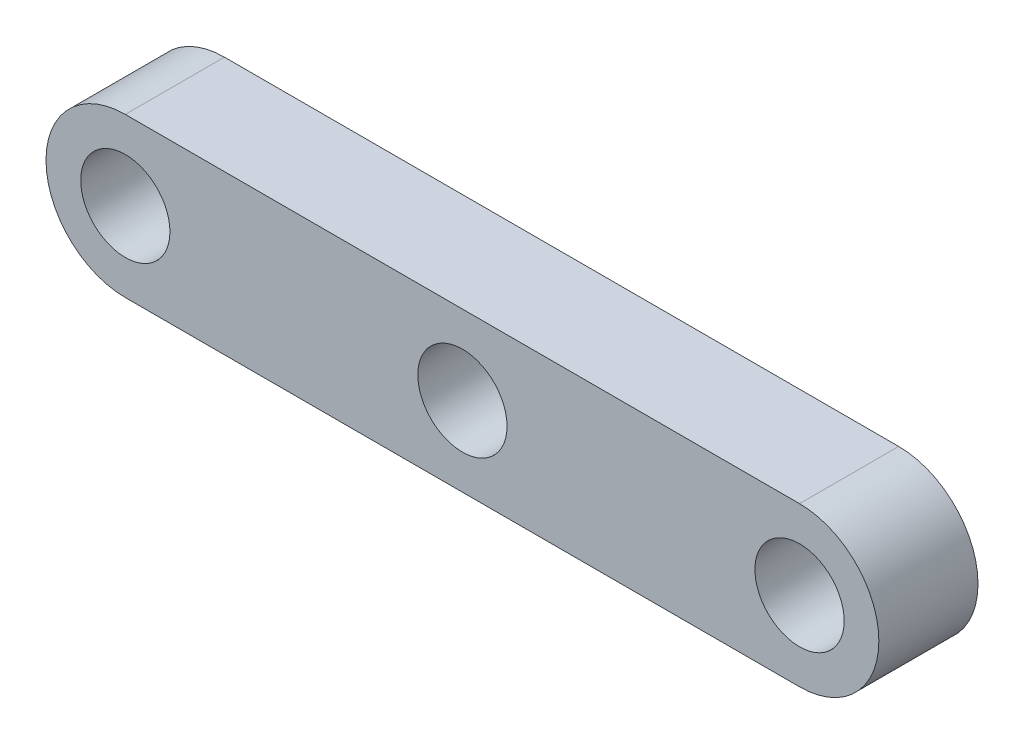
ISO-10303-21;
HEADER;
FILE_DESCRIPTION(('STEP AP214'),'2;1');
FILE_NAME('part.step','',(''),(''),'','','');
FILE_SCHEMA(('AUTOMOTIVE_DESIGN { 1 0 10303 214 1 1 1 1 }'));
ENDSEC;
DATA;
#1=APPLICATION_CONTEXT('core data for automotive mechanical design processes');
#2=APPLICATION_PROTOCOL_DEFINITION('international standard','automotive_design',2000,#1);
#3=PRODUCT_CONTEXT('',#1,'mechanical');
#4=PRODUCT('Part','Part','',(#3));
#5=PRODUCT_RELATED_PRODUCT_CATEGORY('part','',(#4));
#6=PRODUCT_DEFINITION_FORMATION('','',#4);
#7=PRODUCT_DEFINITION_CONTEXT('part definition',#1,'design');
#8=PRODUCT_DEFINITION('design','',#6,#7);
#9=PRODUCT_DEFINITION_SHAPE('','',#8);
#10=(LENGTH_UNIT() NAMED_UNIT(*) SI_UNIT(.MILLI.,.METRE.));
#11=(NAMED_UNIT(*) PLANE_ANGLE_UNIT() SI_UNIT($,.RADIAN.));
#12=(NAMED_UNIT(*) SI_UNIT($,.STERADIAN.) SOLID_ANGLE_UNIT());
#13=UNCERTAINTY_MEASURE_WITH_UNIT(LENGTH_MEASURE(1.E-05),#10,'distance_accuracy_value','');
#14=(GEOMETRIC_REPRESENTATION_CONTEXT(3) GLOBAL_UNCERTAINTY_ASSIGNED_CONTEXT((#13)) GLOBAL_UNIT_ASSIGNED_CONTEXT((#10,
#11,#12)) REPRESENTATION_CONTEXT('',''));
#15=CARTESIAN_POINT('',(0.,0.,0.));
#16=DIRECTION('',(0.,0.,1.));
#17=DIRECTION('',(1.,0.,0.));
#18=AXIS2_PLACEMENT_3D('',#15,#16,#17);
#19=CARTESIAN_POINT('',(-17.,0.,5.));
#20=DIRECTION('',(0.,0.,1.));
#21=DIRECTION('',(1.,0.,0.));
#22=AXIS2_PLACEMENT_3D('',#19,#20,#21);
#23=PLANE('',#22);
#24=CARTESIAN_POINT('',(-17.,0.,5.));
#25=DIRECTION('',(0.,0.,1.));
#26=DIRECTION('',(1.,0.,0.));
#27=AXIS2_PLACEMENT_3D('',#24,#25,#26);
#28=CIRCLE('',#27,2.25);
#29=CARTESIAN_POINT('',(-14.75,0.,5.));
#30=VERTEX_POINT('',#29);
#31=EDGE_CURVE('E115',#30,#30,#28,.T.);
#32=ORIENTED_EDGE('',*,*,#31,.F.);
#33=EDGE_LOOP('',(#32));
#34=FACE_BOUND('',#33,.T.);
#35=CARTESIAN_POINT('',(-17.,0.,5.));
#36=DIRECTION('',(0.,0.,1.));
#37=DIRECTION('',(1.,0.,0.));
#38=AXIS2_PLACEMENT_3D('',#35,#36,#37);
#39=CIRCLE('',#38,4.);
#40=CARTESIAN_POINT('',(-17.,4.,5.));
#41=VERTEX_POINT('',#40);
#42=CARTESIAN_POINT('',(-17.,-4.,5.));
#43=VERTEX_POINT('',#42);
#44=EDGE_CURVE('E85',#41,#43,#39,.T.);
#45=ORIENTED_EDGE('',*,*,#44,.T.);
#46=DIRECTION('',(1.,0.,0.));
#47=VECTOR('',#46,1.);
#48=CARTESIAN_POINT('',(-17.,-4.,5.));
#49=LINE('',#48,#47);
#50=CARTESIAN_POINT('',(17.,-4.,5.));
#51=VERTEX_POINT('',#50);
#52=EDGE_CURVE('E80',#43,#51,#49,.T.);
#53=ORIENTED_EDGE('',*,*,#52,.T.);
#54=CARTESIAN_POINT('',(17.,0.,5.));
#55=DIRECTION('',(0.,0.,1.));
#56=DIRECTION('',(1.,0.,0.));
#57=AXIS2_PLACEMENT_3D('',#54,#55,#56);
#58=CIRCLE('',#57,4.);
#59=CARTESIAN_POINT('',(17.,4.00000000000001,5.));
#60=VERTEX_POINT('',#59);
#61=EDGE_CURVE('E83',#51,#60,#58,.T.);
#62=ORIENTED_EDGE('',*,*,#61,.T.);
#63=DIRECTION('',(-1.,0.,0.));
#64=VECTOR('',#63,1.);
#65=CARTESIAN_POINT('',(-17.,4.,5.));
#66=LINE('',#65,#64);
#67=EDGE_CURVE('E50',#60,#41,#66,.T.);
#68=ORIENTED_EDGE('',*,*,#67,.T.);
#69=EDGE_LOOP('',(#45,#53,#62,#68));
#70=FACE_BOUND('',#69,.T.);
#71=CARTESIAN_POINT('',(0.,0.,5.));
#72=DIRECTION('',(0.,0.,1.));
#73=DIRECTION('',(1.,0.,0.));
#74=AXIS2_PLACEMENT_3D('',#71,#72,#73);
#75=CIRCLE('',#74,2.25);
#76=CARTESIAN_POINT('',(2.25,0.,5.));
#77=VERTEX_POINT('',#76);
#78=EDGE_CURVE('E100',#77,#77,#75,.T.);
#79=ORIENTED_EDGE('',*,*,#78,.F.);
#80=EDGE_LOOP('',(#79));
#81=FACE_BOUND('',#80,.T.);
#82=CARTESIAN_POINT('',(17.,0.,5.));
#83=DIRECTION('',(0.,0.,1.));
#84=DIRECTION('',(1.,0.,0.));
#85=AXIS2_PLACEMENT_3D('',#82,#83,#84);
#86=CIRCLE('',#85,2.25);
#87=CARTESIAN_POINT('',(19.25,0.,5.));
#88=VERTEX_POINT('',#87);
#89=EDGE_CURVE('E121',#88,#88,#86,.T.);
#90=ORIENTED_EDGE('',*,*,#89,.F.);
#91=EDGE_LOOP('',(#90));
#92=FACE_BOUND('',#91,.T.);
#93=ADVANCED_FACE('F33',(#34,#70,#81,#92),#23,.T.);
#94=CARTESIAN_POINT('',(-17.,0.,0.));
#95=DIRECTION('',(0.,0.,1.));
#96=DIRECTION('',(1.,0.,0.));
#97=AXIS2_PLACEMENT_3D('',#94,#95,#96);
#98=PLANE('',#97);
#99=CARTESIAN_POINT('',(-17.,0.,0.));
#100=DIRECTION('',(0.,0.,1.));
#101=DIRECTION('',(1.,0.,0.));
#102=AXIS2_PLACEMENT_3D('',#99,#100,#101);
#103=CIRCLE('',#102,4.);
#104=CARTESIAN_POINT('',(-17.,4.,0.));
#105=VERTEX_POINT('',#104);
#106=CARTESIAN_POINT('',(-17.,-4.,0.));
#107=VERTEX_POINT('',#106);
#108=EDGE_CURVE('E97',#105,#107,#103,.T.);
#109=ORIENTED_EDGE('',*,*,#108,.F.);
#110=DIRECTION('',(-1.,0.,0.));
#111=VECTOR('',#110,1.);
#112=CARTESIAN_POINT('',(-17.,4.,0.));
#113=LINE('',#112,#111);
#114=CARTESIAN_POINT('',(17.,4.00000000000001,0.));
#115=VERTEX_POINT('',#114);
#116=EDGE_CURVE('E73',#115,#105,#113,.T.);
#117=ORIENTED_EDGE('',*,*,#116,.F.);
#118=CARTESIAN_POINT('',(17.,0.,0.));
#119=DIRECTION('',(0.,0.,1.));
#120=DIRECTION('',(1.,0.,0.));
#121=AXIS2_PLACEMENT_3D('',#118,#119,#120);
#122=CIRCLE('',#121,4.);
#123=CARTESIAN_POINT('',(17.,-4.,0.));
#124=VERTEX_POINT('',#123);
#125=EDGE_CURVE('E67',#124,#115,#122,.T.);
#126=ORIENTED_EDGE('',*,*,#125,.F.);
#127=DIRECTION('',(1.,0.,0.));
#128=VECTOR('',#127,1.);
#129=CARTESIAN_POINT('',(-17.,-4.,0.));
#130=LINE('',#129,#128);
#131=EDGE_CURVE('E89',#107,#124,#130,.T.);
#132=ORIENTED_EDGE('',*,*,#131,.F.);
#133=EDGE_LOOP('',(#109,#117,#126,#132));
#134=FACE_BOUND('',#133,.T.);
#135=CARTESIAN_POINT('',(0.,0.,0.));
#136=DIRECTION('',(0.,0.,1.));
#137=DIRECTION('',(1.,0.,0.));
#138=AXIS2_PLACEMENT_3D('',#135,#136,#137);
#139=CIRCLE('',#138,2.25);
#140=CARTESIAN_POINT('',(2.25,0.,0.));
#141=VERTEX_POINT('',#140);
#142=EDGE_CURVE('E112',#141,#141,#139,.T.);
#143=ORIENTED_EDGE('',*,*,#142,.T.);
#144=EDGE_LOOP('',(#143));
#145=FACE_BOUND('',#144,.T.);
#146=CARTESIAN_POINT('',(-17.,0.,0.));
#147=DIRECTION('',(0.,0.,1.));
#148=DIRECTION('',(1.,0.,0.));
#149=AXIS2_PLACEMENT_3D('',#146,#147,#148);
#150=CIRCLE('',#149,2.25);
#151=CARTESIAN_POINT('',(-14.75,0.,0.));
#152=VERTEX_POINT('',#151);
#153=EDGE_CURVE('E118',#152,#152,#150,.T.);
#154=ORIENTED_EDGE('',*,*,#153,.T.);
#155=EDGE_LOOP('',(#154));
#156=FACE_BOUND('',#155,.T.);
#157=CARTESIAN_POINT('',(17.,0.,0.));
#158=DIRECTION('',(0.,0.,1.));
#159=DIRECTION('',(1.,0.,0.));
#160=AXIS2_PLACEMENT_3D('',#157,#158,#159);
#161=CIRCLE('',#160,2.25);
#162=CARTESIAN_POINT('',(19.25,0.,0.));
#163=VERTEX_POINT('',#162);
#164=EDGE_CURVE('E124',#163,#163,#161,.T.);
#165=ORIENTED_EDGE('',*,*,#164,.T.);
#166=EDGE_LOOP('',(#165));
#167=FACE_BOUND('',#166,.T.);
#168=ADVANCED_FACE('F108',(#134,#145,#156,#167),#98,.F.);
#169=CARTESIAN_POINT('',(-17.,0.,5.));
#170=DIRECTION('',(0.,0.,-1.));
#171=DIRECTION('',(-1.,0.,0.));
#172=AXIS2_PLACEMENT_3D('',#169,#170,#171);
#173=CYLINDRICAL_SURFACE('',#172,4.);
#174=ORIENTED_EDGE('',*,*,#108,.T.);
#175=DIRECTION('',(0.,0.,-1.));
#176=VECTOR('',#175,1.);
#177=CARTESIAN_POINT('',(-17.,-4.,5.));
#178=LINE('',#177,#176);
#179=EDGE_CURVE('E11',#43,#107,#178,.T.);
#180=ORIENTED_EDGE('',*,*,#179,.F.);
#181=ORIENTED_EDGE('',*,*,#44,.F.);
#182=DIRECTION('',(0.,0.,-1.));
#183=VECTOR('',#182,1.);
#184=CARTESIAN_POINT('',(-17.,4.,5.));
#185=LINE('',#184,#183);
#186=EDGE_CURVE('E93',#41,#105,#185,.T.);
#187=ORIENTED_EDGE('',*,*,#186,.T.);
#188=EDGE_LOOP('',(#174,#180,#181,#187));
#189=FACE_BOUND('',#188,.T.);
#190=ADVANCED_FACE('F35',(#189),#173,.T.);
#191=CARTESIAN_POINT('',(-17.,-4.,5.));
#192=DIRECTION('',(0.,1.,0.));
#193=DIRECTION('',(-1.,0.,0.));
#194=AXIS2_PLACEMENT_3D('',#191,#192,#193);
#195=PLANE('',#194);
#196=ORIENTED_EDGE('',*,*,#131,.T.);
#197=DIRECTION('',(0.,0.,-1.));
#198=VECTOR('',#197,1.);
#199=CARTESIAN_POINT('',(17.,-4.,5.));
#200=LINE('',#199,#198);
#201=EDGE_CURVE('E42',#51,#124,#200,.T.);
#202=ORIENTED_EDGE('',*,*,#201,.F.);
#203=ORIENTED_EDGE('',*,*,#52,.F.);
#204=ORIENTED_EDGE('',*,*,#179,.T.);
#205=EDGE_LOOP('',(#196,#202,#203,#204));
#206=FACE_BOUND('',#205,.T.);
#207=ADVANCED_FACE('F88',(#206),#195,.F.);
#208=CARTESIAN_POINT('',(17.,0.,5.));
#209=DIRECTION('',(0.,0.,-1.));
#210=DIRECTION('',(-1.,0.,0.));
#211=AXIS2_PLACEMENT_3D('',#208,#209,#210);
#212=CYLINDRICAL_SURFACE('',#211,4.);
#213=ORIENTED_EDGE('',*,*,#125,.T.);
#214=DIRECTION('',(0.,0.,-1.));
#215=VECTOR('',#214,1.);
#216=CARTESIAN_POINT('',(17.,4.00000000000001,5.));
#217=LINE('',#216,#215);
#218=EDGE_CURVE('E90',#60,#115,#217,.T.);
#219=ORIENTED_EDGE('',*,*,#218,.F.);
#220=ORIENTED_EDGE('',*,*,#61,.F.);
#221=ORIENTED_EDGE('',*,*,#201,.T.);
#222=EDGE_LOOP('',(#213,#219,#220,#221));
#223=FACE_BOUND('',#222,.T.);
#224=ADVANCED_FACE('F91',(#223),#212,.T.);
#225=CARTESIAN_POINT('',(-17.,4.,5.));
#226=DIRECTION('',(0.,-1.,0.));
#227=DIRECTION('',(1.,0.,0.));
#228=AXIS2_PLACEMENT_3D('',#225,#226,#227);
#229=PLANE('',#228);
#230=ORIENTED_EDGE('',*,*,#116,.T.);
#231=ORIENTED_EDGE('',*,*,#186,.F.);
#232=ORIENTED_EDGE('',*,*,#67,.F.);
#233=ORIENTED_EDGE('',*,*,#218,.T.);
#234=EDGE_LOOP('',(#230,#231,#232,#233));
#235=FACE_BOUND('',#234,.T.);
#236=ADVANCED_FACE('F105',(#235),#229,.F.);
#237=CARTESIAN_POINT('',(0.,0.,5.));
#238=DIRECTION('',(0.,0.,-1.));
#239=DIRECTION('',(-1.,0.,0.));
#240=AXIS2_PLACEMENT_3D('',#237,#238,#239);
#241=CYLINDRICAL_SURFACE('',#240,2.25);
#242=ORIENTED_EDGE('',*,*,#78,.T.);
#243=EDGE_LOOP('',(#242));
#244=FACE_BOUND('',#243,.T.);
#245=ORIENTED_EDGE('',*,*,#142,.F.);
#246=EDGE_LOOP('',(#245));
#247=FACE_BOUND('',#246,.T.);
#248=ADVANCED_FACE('F142',(#244,#247),#241,.F.);
#249=CARTESIAN_POINT('',(-17.,0.,5.));
#250=DIRECTION('',(0.,0.,-1.));
#251=DIRECTION('',(-1.,0.,0.));
#252=AXIS2_PLACEMENT_3D('',#249,#250,#251);
#253=CYLINDRICAL_SURFACE('',#252,2.25);
#254=ORIENTED_EDGE('',*,*,#31,.T.);
#255=EDGE_LOOP('',(#254));
#256=FACE_BOUND('',#255,.T.);
#257=ORIENTED_EDGE('',*,*,#153,.F.);
#258=EDGE_LOOP('',(#257));
#259=FACE_BOUND('',#258,.T.);
#260=ADVANCED_FACE('F188',(#256,#259),#253,.F.);
#261=CARTESIAN_POINT('',(17.,0.,5.));
#262=DIRECTION('',(0.,0.,-1.));
#263=DIRECTION('',(-1.,0.,0.));
#264=AXIS2_PLACEMENT_3D('',#261,#262,#263);
#265=CYLINDRICAL_SURFACE('',#264,2.25);
#266=ORIENTED_EDGE('',*,*,#89,.T.);
#267=EDGE_LOOP('',(#266));
#268=FACE_BOUND('',#267,.T.);
#269=ORIENTED_EDGE('',*,*,#164,.F.);
#270=EDGE_LOOP('',(#269));
#271=FACE_BOUND('',#270,.T.);
#272=ADVANCED_FACE('F130',(#268,#271),#265,.F.);
#273=CLOSED_SHELL('',(#93,#168,#190,#207,#224,#236,#248,#260,#272));
#274=MANIFOLD_SOLID_BREP('B2',#273);
#275=ADVANCED_BREP_SHAPE_REPRESENTATION('',(#18,#274),#14);
#276=SHAPE_DEFINITION_REPRESENTATION(#9,#275);
ENDSEC;
END-ISO-10303-21;
